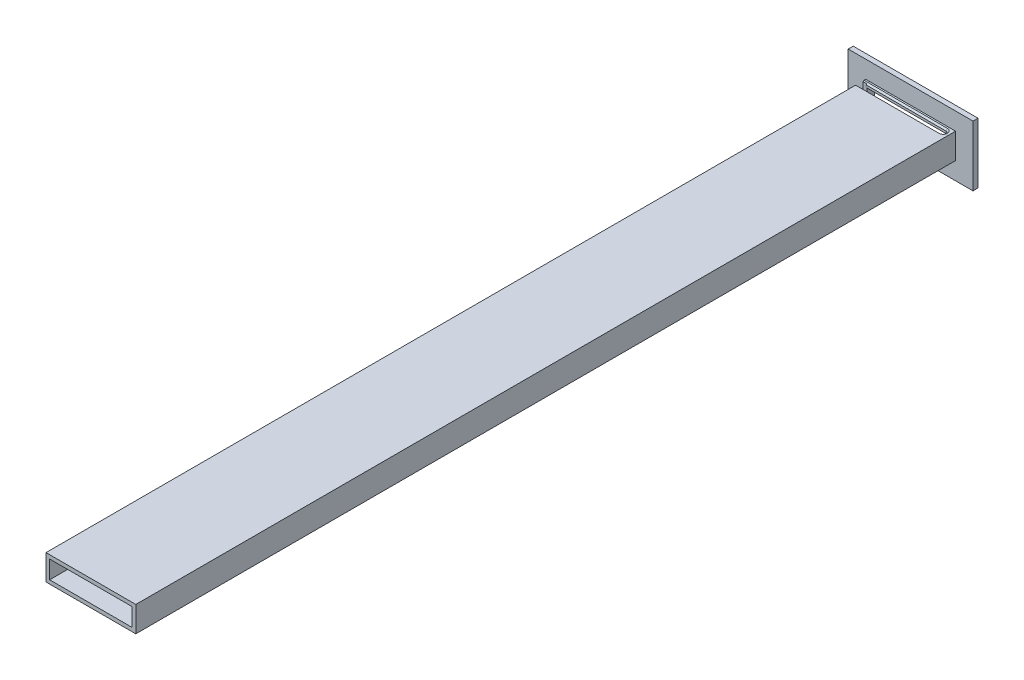
ISO-10303-21;
HEADER;
FILE_DESCRIPTION(('STEP AP214'),'2;1');
FILE_NAME('part.step','',(''),(''),'','','');
FILE_SCHEMA(('AUTOMOTIVE_DESIGN { 1 0 10303 214 1 1 1 1 }'));
ENDSEC;
DATA;
#1=APPLICATION_CONTEXT('core data for automotive mechanical design processes');
#2=APPLICATION_PROTOCOL_DEFINITION('international standard','automotive_design',2000,#1);
#3=PRODUCT_CONTEXT('',#1,'mechanical');
#4=PRODUCT('Part','Part','',(#3));
#5=PRODUCT_RELATED_PRODUCT_CATEGORY('part','',(#4));
#6=PRODUCT_DEFINITION_FORMATION('','',#4);
#7=PRODUCT_DEFINITION_CONTEXT('part definition',#1,'design');
#8=PRODUCT_DEFINITION('design','',#6,#7);
#9=PRODUCT_DEFINITION_SHAPE('','',#8);
#10=(LENGTH_UNIT() NAMED_UNIT(*) SI_UNIT(.MILLI.,.METRE.));
#11=(NAMED_UNIT(*) PLANE_ANGLE_UNIT() SI_UNIT($,.RADIAN.));
#12=(NAMED_UNIT(*) SI_UNIT($,.STERADIAN.) SOLID_ANGLE_UNIT());
#13=UNCERTAINTY_MEASURE_WITH_UNIT(LENGTH_MEASURE(1.E-05),#10,'distance_accuracy_value','');
#14=(GEOMETRIC_REPRESENTATION_CONTEXT(3) GLOBAL_UNCERTAINTY_ASSIGNED_CONTEXT((#13)) GLOBAL_UNIT_ASSIGNED_CONTEXT((#10,
#11,#12)) REPRESENTATION_CONTEXT('',''));
#15=CARTESIAN_POINT('',(0.,0.,0.));
#16=DIRECTION('',(0.,0.,1.));
#17=DIRECTION('',(1.,0.,0.));
#18=AXIS2_PLACEMENT_3D('',#15,#16,#17);
#19=CARTESIAN_POINT('',(-16.5,3.6,330.));
#20=DIRECTION('',(0.,-1.,0.));
#21=DIRECTION('',(0.,0.,-1.));
#22=AXIS2_PLACEMENT_3D('',#19,#20,#21);
#23=PLANE('',#22);
#24=DIRECTION('',(0.,0.,-1.));
#25=VECTOR('',#24,1.);
#26=CARTESIAN_POINT('',(-16.5,3.6,0.));
#27=LINE('',#26,#25);
#28=CARTESIAN_POINT('',(-16.5,3.6,3.24999999999998));
#29=VERTEX_POINT('',#28);
#30=CARTESIAN_POINT('',(-16.5,3.6,3.));
#31=VERTEX_POINT('',#30);
#32=EDGE_CURVE('E325',#29,#31,#27,.T.);
#33=ORIENTED_EDGE('',*,*,#32,.T.);
#34=DIRECTION('',(0.,0.,-1.));
#35=VECTOR('',#34,1.);
#36=CARTESIAN_POINT('',(-16.5,3.6,330.));
#37=LINE('',#36,#35);
#38=CARTESIAN_POINT('',(-16.5,3.6,0.));
#39=VERTEX_POINT('',#38);
#40=EDGE_CURVE('E404',#31,#39,#37,.T.);
#41=ORIENTED_EDGE('',*,*,#40,.T.);
#42=DIRECTION('',(-1.,0.,0.));
#43=VECTOR('',#42,1.);
#44=CARTESIAN_POINT('',(-16.5,3.6,0.));
#45=LINE('',#44,#43);
#46=CARTESIAN_POINT('',(16.5,3.6,0.));
#47=VERTEX_POINT('',#46);
#48=EDGE_CURVE('E387',#47,#39,#45,.T.);
#49=ORIENTED_EDGE('',*,*,#48,.F.);
#50=DIRECTION('',(0.,0.,-1.));
#51=VECTOR('',#50,1.);
#52=CARTESIAN_POINT('',(16.5,3.6,330.));
#53=LINE('',#52,#51);
#54=CARTESIAN_POINT('',(16.5,3.6,4.35000000000002));
#55=VERTEX_POINT('',#54);
#56=EDGE_CURVE('E409',#55,#47,#53,.T.);
#57=ORIENTED_EDGE('',*,*,#56,.F.);
#58=CARTESIAN_POINT('',(15.4,3.6,4.35000000000002));
#59=DIRECTION('',(0.,-1.,0.));
#60=DIRECTION('',(0.,0.,-1.));
#61=AXIS2_PLACEMENT_3D('',#58,#59,#60);
#62=CIRCLE('',#61,1.10000000000002);
#63=CARTESIAN_POINT('',(15.4,3.6,3.24999999999998));
#64=VERTEX_POINT('',#63);
#65=EDGE_CURVE('E315',#55,#64,#62,.F.);
#66=ORIENTED_EDGE('',*,*,#65,.T.);
#67=DIRECTION('',(1.,0.,0.));
#68=VECTOR('',#67,1.);
#69=CARTESIAN_POINT('',(0.,3.6,3.24999999999998));
#70=LINE('',#69,#68);
#71=EDGE_CURVE('E318',#29,#64,#70,.T.);
#72=ORIENTED_EDGE('',*,*,#71,.F.);
#73=EDGE_LOOP('',(#33,#41,#49,#57,#66,#72));
#74=FACE_BOUND('',#73,.T.);
#75=ADVANCED_FACE('F41',(#74),#23,.T.);
#76=CARTESIAN_POINT('',(-17.9659090909091,5.10000000000001,330.));
#77=DIRECTION('',(1.,0.,0.));
#78=DIRECTION('',(0.,0.,-1.));
#79=AXIS2_PLACEMENT_3D('',#76,#77,#78);
#80=PLANE('',#79);
#81=DIRECTION('',(0.,0.,-1.));
#82=VECTOR('',#81,1.);
#83=CARTESIAN_POINT('',(-17.9659090909091,5.10000000000001,330.));
#84=LINE('',#83,#82);
#85=CARTESIAN_POINT('',(-17.9659090909091,5.10000000000001,2.65000000000004));
#86=VERTEX_POINT('',#85);
#87=CARTESIAN_POINT('',(-17.9659090909091,5.10000000000001,2.));
#88=VERTEX_POINT('',#87);
#89=EDGE_CURVE('E237',#86,#88,#84,.T.);
#90=ORIENTED_EDGE('',*,*,#89,.T.);
#91=DIRECTION('',(0.,1.,0.));
#92=VECTOR('',#91,1.);
#93=CARTESIAN_POINT('',(-17.9659090909091,5.10000000000001,2.));
#94=LINE('',#93,#92);
#95=CARTESIAN_POINT('',(-17.9659090909091,-5.1,2.));
#96=VERTEX_POINT('',#95);
#97=EDGE_CURVE('E205',#96,#88,#94,.T.);
#98=ORIENTED_EDGE('',*,*,#97,.F.);
#99=DIRECTION('',(0.,0.,-1.));
#100=VECTOR('',#99,1.);
#101=CARTESIAN_POINT('',(-17.9659090909091,-5.1,330.));
#102=LINE('',#101,#100);
#103=CARTESIAN_POINT('',(-17.9659090909091,-5.1,330.));
#104=VERTEX_POINT('',#103);
#105=EDGE_CURVE('E426',#104,#96,#102,.T.);
#106=ORIENTED_EDGE('',*,*,#105,.F.);
#107=DIRECTION('',(0.,-1.,0.));
#108=VECTOR('',#107,1.);
#109=CARTESIAN_POINT('',(-17.9659090909091,5.10000000000001,330.));
#110=LINE('',#109,#108);
#111=CARTESIAN_POINT('',(-17.9659090909091,5.10000000000001,330.));
#112=VERTEX_POINT('',#111);
#113=EDGE_CURVE('E419',#112,#104,#110,.T.);
#114=ORIENTED_EDGE('',*,*,#113,.F.);
#115=CARTESIAN_POINT('',(-17.9659090909091,5.10000000000001,6.05000000000006));
#116=VERTEX_POINT('',#115);
#117=EDGE_CURVE('E229',#112,#116,#84,.T.);
#118=ORIENTED_EDGE('',*,*,#117,.T.);
#119=DIRECTION('',(0.,-0.707106781186523,-0.707106781186572));
#120=VECTOR('',#119,1.);
#121=CARTESIAN_POINT('',(-17.9659090909091,5.10000000000001,6.05000000000006));
#122=LINE('',#121,#120);
#123=CARTESIAN_POINT('',(-17.9659090909091,4.74999999999998,5.7));
#124=VERTEX_POINT('',#123);
#125=EDGE_CURVE('E266',#116,#124,#122,.T.);
#126=ORIENTED_EDGE('',*,*,#125,.T.);
#127=DIRECTION('',(0.,-1.,0.));
#128=VECTOR('',#127,1.);
#129=CARTESIAN_POINT('',(-17.9659090909091,0.,5.7));
#130=LINE('',#129,#128);
#131=CARTESIAN_POINT('',(-17.9659090909091,0.399999999999998,5.69999999999998));
#132=VERTEX_POINT('',#131);
#133=EDGE_CURVE('E350',#124,#132,#130,.T.);
#134=ORIENTED_EDGE('',*,*,#133,.T.);
#135=DIRECTION('',(0.,0.,1.));
#136=VECTOR('',#135,1.);
#137=CARTESIAN_POINT('',(-17.9659090909091,0.399999999999994,0.));
#138=LINE('',#137,#136);
#139=CARTESIAN_POINT('',(-17.9659090909091,0.399999999999996,3.));
#140=VERTEX_POINT('',#139);
#141=EDGE_CURVE('E356',#140,#132,#138,.T.);
#142=ORIENTED_EDGE('',*,*,#141,.F.);
#143=DIRECTION('',(0.,-1.,0.));
#144=VECTOR('',#143,1.);
#145=CARTESIAN_POINT('',(-17.9659090909091,0.,3.));
#146=LINE('',#145,#144);
#147=CARTESIAN_POINT('',(-17.9659090909091,4.75000000000003,3.));
#148=VERTEX_POINT('',#147);
#149=EDGE_CURVE('E353',#148,#140,#146,.T.);
#150=ORIENTED_EDGE('',*,*,#149,.F.);
#151=DIRECTION('',(0.,0.707106781186563,-0.707106781186532));
#152=VECTOR('',#151,1.);
#153=CARTESIAN_POINT('',(-17.9659090909091,5.10000000000001,2.65000000000004));
#154=LINE('',#153,#152);
#155=EDGE_CURVE('E269',#148,#86,#154,.T.);
#156=ORIENTED_EDGE('',*,*,#155,.T.);
#157=EDGE_LOOP('',(#90,#98,#106,#114,#118,#126,#134,#142,#150,#156));
#158=FACE_BOUND('',#157,.T.);
#159=ADVANCED_FACE('F434',(#158),#80,.F.);
#160=CARTESIAN_POINT('',(0.,0.,330.));
#161=DIRECTION('',(0.,0.,1.));
#162=DIRECTION('',(1.,0.,0.));
#163=AXIS2_PLACEMENT_3D('',#160,#161,#162);
#164=PLANE('',#163);
#165=DIRECTION('',(0.,1.,0.));
#166=VECTOR('',#165,1.);
#167=CARTESIAN_POINT('',(17.9659090909091,5.10000000000001,330.));
#168=LINE('',#167,#166);
#169=CARTESIAN_POINT('',(17.9659090909091,-5.1,330.));
#170=VERTEX_POINT('',#169);
#171=CARTESIAN_POINT('',(17.9659090909091,5.10000000000001,330.));
#172=VERTEX_POINT('',#171);
#173=EDGE_CURVE('E414',#170,#172,#168,.T.);
#174=ORIENTED_EDGE('',*,*,#173,.T.);
#175=DIRECTION('',(-1.,0.,0.));
#176=VECTOR('',#175,1.);
#177=CARTESIAN_POINT('',(-17.9659090909091,5.10000000000001,330.));
#178=LINE('',#177,#176);
#179=EDGE_CURVE('E225',#172,#112,#178,.T.);
#180=ORIENTED_EDGE('',*,*,#179,.T.);
#181=ORIENTED_EDGE('',*,*,#113,.T.);
#182=DIRECTION('',(1.,0.,0.));
#183=VECTOR('',#182,1.);
#184=CARTESIAN_POINT('',(-17.9659090909091,-5.1,330.));
#185=LINE('',#184,#183);
#186=EDGE_CURVE('E422',#104,#170,#185,.T.);
#187=ORIENTED_EDGE('',*,*,#186,.T.);
#188=EDGE_LOOP('',(#174,#180,#181,#187));
#189=FACE_BOUND('',#188,.T.);
#190=DIRECTION('',(-1.,0.,0.));
#191=VECTOR('',#190,1.);
#192=CARTESIAN_POINT('',(-16.5,3.6,330.));
#193=LINE('',#192,#191);
#194=CARTESIAN_POINT('',(16.5,3.6,330.));
#195=VERTEX_POINT('',#194);
#196=CARTESIAN_POINT('',(-16.5,3.6,330.));
#197=VERTEX_POINT('',#196);
#198=EDGE_CURVE('E372',#195,#197,#193,.T.);
#199=ORIENTED_EDGE('',*,*,#198,.F.);
#200=DIRECTION('',(0.,1.,0.));
#201=VECTOR('',#200,1.);
#202=CARTESIAN_POINT('',(16.5,3.6,330.));
#203=LINE('',#202,#201);
#204=CARTESIAN_POINT('',(16.5,-3.6,330.));
#205=VERTEX_POINT('',#204);
#206=EDGE_CURVE('E369',#205,#195,#203,.T.);
#207=ORIENTED_EDGE('',*,*,#206,.F.);
#208=DIRECTION('',(1.,0.,0.));
#209=VECTOR('',#208,1.);
#210=CARTESIAN_POINT('',(-16.5,-3.6,330.));
#211=LINE('',#210,#209);
#212=CARTESIAN_POINT('',(-16.5,-3.6,330.));
#213=VERTEX_POINT('',#212);
#214=EDGE_CURVE('E380',#213,#205,#211,.T.);
#215=ORIENTED_EDGE('',*,*,#214,.F.);
#216=DIRECTION('',(0.,-1.,0.));
#217=VECTOR('',#216,1.);
#218=CARTESIAN_POINT('',(-16.5,3.6,330.));
#219=LINE('',#218,#217);
#220=EDGE_CURVE('E376',#197,#213,#219,.T.);
#221=ORIENTED_EDGE('',*,*,#220,.F.);
#222=EDGE_LOOP('',(#199,#207,#215,#221));
#223=FACE_BOUND('',#222,.T.);
#224=ADVANCED_FACE('F465',(#189,#223),#164,.T.);
#225=CARTESIAN_POINT('',(0.,0.,0.));
#226=DIRECTION('',(0.,0.,1.));
#227=DIRECTION('',(1.,0.,0.));
#228=AXIS2_PLACEMENT_3D('',#225,#226,#227);
#229=PLANE('',#228);
#230=DIRECTION('',(0.,1.,0.));
#231=VECTOR('',#230,1.);
#232=CARTESIAN_POINT('',(16.5,3.6,0.));
#233=LINE('',#232,#231);
#234=CARTESIAN_POINT('',(16.5,-3.6,0.));
#235=VERTEX_POINT('',#234);
#236=EDGE_CURVE('E365',#235,#47,#233,.T.);
#237=ORIENTED_EDGE('',*,*,#236,.T.);
#238=ORIENTED_EDGE('',*,*,#48,.T.);
#239=DIRECTION('',(0.,-1.,0.));
#240=VECTOR('',#239,1.);
#241=CARTESIAN_POINT('',(-16.5,3.6,0.));
#242=LINE('',#241,#240);
#243=CARTESIAN_POINT('',(-16.5,-3.6,0.));
#244=VERTEX_POINT('',#243);
#245=EDGE_CURVE('E391',#39,#244,#242,.T.);
#246=ORIENTED_EDGE('',*,*,#245,.T.);
#247=DIRECTION('',(1.,0.,0.));
#248=VECTOR('',#247,1.);
#249=CARTESIAN_POINT('',(-16.5,-3.6,0.));
#250=LINE('',#249,#248);
#251=EDGE_CURVE('E373',#244,#235,#250,.T.);
#252=ORIENTED_EDGE('',*,*,#251,.T.);
#253=EDGE_LOOP('',(#237,#238,#246,#252));
#254=FACE_BOUND('',#253,.T.);
#255=DIRECTION('',(0.,1.,0.));
#256=VECTOR('',#255,1.);
#257=CARTESIAN_POINT('',(-24.9659090909091,-12.1,0.));
#258=LINE('',#257,#256);
#259=CARTESIAN_POINT('',(-24.9659090909091,-12.1,0.));
#260=VERTEX_POINT('',#259);
#261=CARTESIAN_POINT('',(-24.9659090909091,12.1,0.));
#262=VERTEX_POINT('',#261);
#263=EDGE_CURVE('E508',#260,#262,#258,.T.);
#264=ORIENTED_EDGE('',*,*,#263,.T.);
#265=DIRECTION('',(1.,0.,0.));
#266=VECTOR('',#265,1.);
#267=CARTESIAN_POINT('',(24.9659090909091,12.1,0.));
#268=LINE('',#267,#266);
#269=CARTESIAN_POINT('',(24.9659090909091,12.1,0.));
#270=VERTEX_POINT('',#269);
#271=EDGE_CURVE('E528',#262,#270,#268,.T.);
#272=ORIENTED_EDGE('',*,*,#271,.T.);
#273=DIRECTION('',(0.,-1.,0.));
#274=VECTOR('',#273,1.);
#275=CARTESIAN_POINT('',(24.9659090909091,-12.1,0.));
#276=LINE('',#275,#274);
#277=CARTESIAN_POINT('',(24.9659090909091,-12.1,0.));
#278=VERTEX_POINT('',#277);
#279=EDGE_CURVE('E531',#270,#278,#276,.T.);
#280=ORIENTED_EDGE('',*,*,#279,.T.);
#281=DIRECTION('',(-1.,0.,0.));
#282=VECTOR('',#281,1.);
#283=CARTESIAN_POINT('',(24.9659090909091,-12.1,0.));
#284=LINE('',#283,#282);
#285=EDGE_CURVE('E301',#278,#260,#284,.T.);
#286=ORIENTED_EDGE('',*,*,#285,.T.);
#287=EDGE_LOOP('',(#264,#272,#280,#286));
#288=FACE_BOUND('',#287,.T.);
#289=ADVANCED_FACE('F474',(#254,#288),#229,.F.);
#290=CARTESIAN_POINT('',(17.9659090909091,5.10000000000001,330.));
#291=DIRECTION('',(-1.,0.,0.));
#292=DIRECTION('',(0.,-1.,0.));
#293=AXIS2_PLACEMENT_3D('',#290,#291,#292);
#294=PLANE('',#293);
#295=DIRECTION('',(0.,0.,-1.));
#296=VECTOR('',#295,1.);
#297=CARTESIAN_POINT('',(17.9659090909091,-5.1,330.));
#298=LINE('',#297,#296);
#299=CARTESIAN_POINT('',(17.9659090909091,-5.1,2.));
#300=VERTEX_POINT('',#299);
#301=EDGE_CURVE('E219',#170,#300,#298,.T.);
#302=ORIENTED_EDGE('',*,*,#301,.T.);
#303=DIRECTION('',(0.,-1.,0.));
#304=VECTOR('',#303,1.);
#305=CARTESIAN_POINT('',(17.9659090909091,-5.1,2.));
#306=LINE('',#305,#304);
#307=CARTESIAN_POINT('',(17.9659090909091,5.10000000000001,2.));
#308=VERTEX_POINT('',#307);
#309=EDGE_CURVE('E60',#308,#300,#306,.T.);
#310=ORIENTED_EDGE('',*,*,#309,.F.);
#311=DIRECTION('',(0.,0.,-1.));
#312=VECTOR('',#311,1.);
#313=CARTESIAN_POINT('',(17.9659090909091,5.10000000000001,330.));
#314=LINE('',#313,#312);
#315=EDGE_CURVE('E217',#172,#308,#314,.T.);
#316=ORIENTED_EDGE('',*,*,#315,.F.);
#317=ORIENTED_EDGE('',*,*,#173,.F.);
#318=EDGE_LOOP('',(#302,#310,#316,#317));
#319=FACE_BOUND('',#318,.T.);
#320=ADVANCED_FACE('F215',(#319),#294,.F.);
#321=CARTESIAN_POINT('',(-17.9659090909091,5.10000000000001,330.));
#322=DIRECTION('',(0.,-1.,0.));
#323=DIRECTION('',(0.,0.,-1.));
#324=AXIS2_PLACEMENT_3D('',#321,#322,#323);
#325=PLANE('',#324);
#326=ORIENTED_EDGE('',*,*,#315,.T.);
#327=DIRECTION('',(1.,0.,0.));
#328=VECTOR('',#327,1.);
#329=CARTESIAN_POINT('',(17.9659090909091,5.10000000000001,2.));
#330=LINE('',#329,#328);
#331=EDGE_CURVE('E201',#88,#308,#330,.T.);
#332=ORIENTED_EDGE('',*,*,#331,.F.);
#333=ORIENTED_EDGE('',*,*,#89,.F.);
#334=DIRECTION('',(1.,0.,0.));
#335=VECTOR('',#334,1.);
#336=CARTESIAN_POINT('',(15.4,5.10000000000001,2.65000000000005));
#337=LINE('',#336,#335);
#338=CARTESIAN_POINT('',(15.4,5.10000000000001,2.64999999999998));
#339=VERTEX_POINT('',#338);
#340=EDGE_CURVE('E253',#86,#339,#337,.T.);
#341=ORIENTED_EDGE('',*,*,#340,.T.);
#342=CARTESIAN_POINT('',(15.4,5.10000000000001,4.35000000000002));
#343=DIRECTION('',(0.,-1.,0.));
#344=DIRECTION('',(0.,0.,-1.));
#345=AXIS2_PLACEMENT_3D('',#342,#343,#344);
#346=CIRCLE('',#345,1.70000000000004);
#347=CARTESIAN_POINT('',(15.4,5.10000000000001,6.05000000000005));
#348=VERTEX_POINT('',#347);
#349=EDGE_CURVE('E250',#339,#348,#346,.T.);
#350=ORIENTED_EDGE('',*,*,#349,.T.);
#351=DIRECTION('',(-1.,0.,0.));
#352=VECTOR('',#351,1.);
#353=CARTESIAN_POINT('',(-16.5,5.10000000000001,6.05000000000006));
#354=LINE('',#353,#352);
#355=EDGE_CURVE('E247',#348,#116,#354,.T.);
#356=ORIENTED_EDGE('',*,*,#355,.T.);
#357=ORIENTED_EDGE('',*,*,#117,.F.);
#358=ORIENTED_EDGE('',*,*,#179,.F.);
#359=EDGE_LOOP('',(#326,#332,#333,#341,#350,#356,#357,#358));
#360=FACE_BOUND('',#359,.T.);
#361=ADVANCED_FACE('F223',(#360),#325,.F.);
#362=CARTESIAN_POINT('',(-17.9659090909091,-5.1,330.));
#363=DIRECTION('',(0.,1.,0.));
#364=DIRECTION('',(-1.,0.,0.));
#365=AXIS2_PLACEMENT_3D('',#362,#363,#364);
#366=PLANE('',#365);
#367=ORIENTED_EDGE('',*,*,#105,.T.);
#368=DIRECTION('',(-1.,0.,0.));
#369=VECTOR('',#368,1.);
#370=CARTESIAN_POINT('',(-17.9659090909091,-5.1,2.));
#371=LINE('',#370,#369);
#372=EDGE_CURVE('E221',#300,#96,#371,.T.);
#373=ORIENTED_EDGE('',*,*,#372,.F.);
#374=ORIENTED_EDGE('',*,*,#301,.F.);
#375=ORIENTED_EDGE('',*,*,#186,.F.);
#376=EDGE_LOOP('',(#367,#373,#374,#375));
#377=FACE_BOUND('',#376,.T.);
#378=ADVANCED_FACE('F504',(#377),#366,.F.);
#379=CARTESIAN_POINT('',(16.5,3.6,330.));
#380=DIRECTION('',(-1.,0.,0.));
#381=DIRECTION('',(0.,-1.,0.));
#382=AXIS2_PLACEMENT_3D('',#379,#380,#381);
#383=PLANE('',#382);
#384=EDGE_CURVE('E410',#195,#55,#53,.T.);
#385=ORIENTED_EDGE('',*,*,#384,.T.);
#386=ORIENTED_EDGE('',*,*,#56,.T.);
#387=ORIENTED_EDGE('',*,*,#236,.F.);
#388=DIRECTION('',(0.,0.,-1.));
#389=VECTOR('',#388,1.);
#390=CARTESIAN_POINT('',(16.5,-3.6,330.));
#391=LINE('',#390,#389);
#392=EDGE_CURVE('E383',#205,#235,#391,.T.);
#393=ORIENTED_EDGE('',*,*,#392,.F.);
#394=ORIENTED_EDGE('',*,*,#206,.T.);
#395=EDGE_LOOP('',(#385,#386,#387,#393,#394));
#396=FACE_BOUND('',#395,.T.);
#397=ADVANCED_FACE('F568',(#396),#383,.T.);
#398=CARTESIAN_POINT('',(15.4,3.6,5.45000000000004));
#399=VERTEX_POINT('',#398);
#400=EDGE_CURVE('E310',#399,#55,#62,.F.);
#401=ORIENTED_EDGE('',*,*,#400,.T.);
#402=ORIENTED_EDGE('',*,*,#384,.F.);
#403=ORIENTED_EDGE('',*,*,#198,.T.);
#404=CARTESIAN_POINT('',(-16.5,3.6,5.69999999999998));
#405=VERTEX_POINT('',#404);
#406=EDGE_CURVE('E405',#197,#405,#37,.T.);
#407=ORIENTED_EDGE('',*,*,#406,.T.);
#408=DIRECTION('',(0.,0.,-1.));
#409=VECTOR('',#408,1.);
#410=CARTESIAN_POINT('',(-16.5,3.6,0.));
#411=LINE('',#410,#409);
#412=CARTESIAN_POINT('',(-16.5,3.6,5.45000000000002));
#413=VERTEX_POINT('',#412);
#414=EDGE_CURVE('E319',#405,#413,#411,.T.);
#415=ORIENTED_EDGE('',*,*,#414,.T.);
#416=DIRECTION('',(-1.,0.,0.));
#417=VECTOR('',#416,1.);
#418=CARTESIAN_POINT('',(0.,3.6,5.45000000000002));
#419=LINE('',#418,#417);
#420=EDGE_CURVE('E290',#399,#413,#419,.T.);
#421=ORIENTED_EDGE('',*,*,#420,.F.);
#422=EDGE_LOOP('',(#401,#402,#403,#407,#415,#421));
#423=FACE_BOUND('',#422,.T.);
#424=ADVANCED_FACE('F459',(#423),#23,.T.);
#425=CARTESIAN_POINT('',(-16.5,3.6,330.));
#426=DIRECTION('',(1.,0.,0.));
#427=DIRECTION('',(0.,1.,0.));
#428=AXIS2_PLACEMENT_3D('',#425,#426,#427);
#429=PLANE('',#428);
#430=DIRECTION('',(0.,1.,0.));
#431=VECTOR('',#430,1.);
#432=CARTESIAN_POINT('',(-16.5,3.6,3.));
#433=LINE('',#432,#431);
#434=CARTESIAN_POINT('',(-16.5,0.399999999999996,3.));
#435=VERTEX_POINT('',#434);
#436=EDGE_CURVE('E243',#435,#31,#433,.T.);
#437=ORIENTED_EDGE('',*,*,#436,.F.);
#438=DIRECTION('',(0.,0.,-1.));
#439=VECTOR('',#438,1.);
#440=CARTESIAN_POINT('',(-16.5,0.400000000000259,330.));
#441=LINE('',#440,#439);
#442=CARTESIAN_POINT('',(-16.5,0.399999999999998,5.7));
#443=VERTEX_POINT('',#442);
#444=EDGE_CURVE('E234',#443,#435,#441,.T.);
#445=ORIENTED_EDGE('',*,*,#444,.F.);
#446=DIRECTION('',(0.,1.,0.));
#447=VECTOR('',#446,1.);
#448=CARTESIAN_POINT('',(-16.5,3.6,5.69999999999998));
#449=LINE('',#448,#447);
#450=EDGE_CURVE('E228',#443,#405,#449,.T.);
#451=ORIENTED_EDGE('',*,*,#450,.T.);
#452=ORIENTED_EDGE('',*,*,#406,.F.);
#453=ORIENTED_EDGE('',*,*,#220,.T.);
#454=DIRECTION('',(0.,0.,-1.));
#455=VECTOR('',#454,1.);
#456=CARTESIAN_POINT('',(-16.5,-3.6,330.));
#457=LINE('',#456,#455);
#458=EDGE_CURVE('E401',#213,#244,#457,.T.);
#459=ORIENTED_EDGE('',*,*,#458,.T.);
#460=ORIENTED_EDGE('',*,*,#245,.F.);
#461=ORIENTED_EDGE('',*,*,#40,.F.);
#462=EDGE_LOOP('',(#437,#445,#451,#452,#453,#459,#460,#461));
#463=FACE_BOUND('',#462,.T.);
#464=ADVANCED_FACE('F456',(#463),#429,.T.);
#465=CARTESIAN_POINT('',(-16.5,-3.6,330.));
#466=DIRECTION('',(0.,1.,0.));
#467=DIRECTION('',(0.,0.,1.));
#468=AXIS2_PLACEMENT_3D('',#465,#466,#467);
#469=PLANE('',#468);
#470=ORIENTED_EDGE('',*,*,#251,.F.);
#471=ORIENTED_EDGE('',*,*,#458,.F.);
#472=ORIENTED_EDGE('',*,*,#214,.T.);
#473=ORIENTED_EDGE('',*,*,#392,.T.);
#474=EDGE_LOOP('',(#470,#471,#472,#473));
#475=FACE_BOUND('',#474,.T.);
#476=ADVANCED_FACE('F471',(#475),#469,.T.);
#477=CARTESIAN_POINT('',(20.6868842830917,0.,3.));
#478=DIRECTION('',(0.,0.,-1.));
#479=DIRECTION('',(-1.,0.,0.));
#480=AXIS2_PLACEMENT_3D('',#477,#478,#479);
#481=PLANE('',#480);
#482=DIRECTION('',(0.,1.,0.));
#483=VECTOR('',#482,1.);
#484=CARTESIAN_POINT('',(-16.5,-30.9715040092677,3.));
#485=LINE('',#484,#483);
#486=CARTESIAN_POINT('',(-16.5,4.75000000000003,3.));
#487=VERTEX_POINT('',#486);
#488=EDGE_CURVE('E329',#31,#487,#485,.T.);
#489=ORIENTED_EDGE('',*,*,#488,.T.);
#490=DIRECTION('',(-1.,0.,0.));
#491=VECTOR('',#490,1.);
#492=CARTESIAN_POINT('',(-17.9659090909091,4.75000000000003,3.));
#493=LINE('',#492,#491);
#494=EDGE_CURVE('E263',#487,#148,#493,.T.);
#495=ORIENTED_EDGE('',*,*,#494,.T.);
#496=ORIENTED_EDGE('',*,*,#149,.T.);
#497=DIRECTION('',(-1.,0.,0.));
#498=VECTOR('',#497,1.);
#499=CARTESIAN_POINT('',(20.6868842830917,0.399999999999996,3.));
#500=LINE('',#499,#498);
#501=EDGE_CURVE('E360',#435,#140,#500,.T.);
#502=ORIENTED_EDGE('',*,*,#501,.F.);
#503=ORIENTED_EDGE('',*,*,#436,.T.);
#504=EDGE_LOOP('',(#489,#495,#496,#502,#503));
#505=FACE_BOUND('',#504,.T.);
#506=ADVANCED_FACE('F441',(#505),#481,.F.);
#507=CARTESIAN_POINT('',(20.6868842830917,0.399999999999994,0.));
#508=DIRECTION('',(0.,-1.,0.));
#509=DIRECTION('',(0.,0.,-1.));
#510=AXIS2_PLACEMENT_3D('',#507,#508,#509);
#511=PLANE('',#510);
#512=ORIENTED_EDGE('',*,*,#444,.T.);
#513=ORIENTED_EDGE('',*,*,#501,.T.);
#514=ORIENTED_EDGE('',*,*,#141,.T.);
#515=DIRECTION('',(-1.,0.,0.));
#516=VECTOR('',#515,1.);
#517=CARTESIAN_POINT('',(20.6868842830917,0.399999999999998,5.7));
#518=LINE('',#517,#516);
#519=EDGE_CURVE('E361',#443,#132,#518,.T.);
#520=ORIENTED_EDGE('',*,*,#519,.F.);
#521=EDGE_LOOP('',(#512,#513,#514,#520));
#522=FACE_BOUND('',#521,.T.);
#523=ADVANCED_FACE('F447',(#522),#511,.F.);
#524=CARTESIAN_POINT('',(20.6868842830917,0.,5.7));
#525=DIRECTION('',(0.,0.,-1.));
#526=DIRECTION('',(-1.,0.,0.));
#527=AXIS2_PLACEMENT_3D('',#524,#525,#526);
#528=PLANE('',#527);
#529=ORIENTED_EDGE('',*,*,#133,.F.);
#530=DIRECTION('',(1.,0.,0.));
#531=VECTOR('',#530,1.);
#532=CARTESIAN_POINT('',(20.6868842830917,4.74999999999998,5.7));
#533=LINE('',#532,#531);
#534=CARTESIAN_POINT('',(-16.5,4.74999999999998,5.7));
#535=VERTEX_POINT('',#534);
#536=EDGE_CURVE('E275',#124,#535,#533,.T.);
#537=ORIENTED_EDGE('',*,*,#536,.T.);
#538=DIRECTION('',(0.,1.,0.));
#539=VECTOR('',#538,1.);
#540=CARTESIAN_POINT('',(-16.5,-30.9715040092677,5.7));
#541=LINE('',#540,#539);
#542=EDGE_CURVE('E324',#405,#535,#541,.T.);
#543=ORIENTED_EDGE('',*,*,#542,.F.);
#544=ORIENTED_EDGE('',*,*,#450,.F.);
#545=ORIENTED_EDGE('',*,*,#519,.T.);
#546=EDGE_LOOP('',(#529,#537,#543,#544,#545));
#547=FACE_BOUND('',#546,.T.);
#548=ADVANCED_FACE('F450',(#547),#528,.T.);
#549=CARTESIAN_POINT('',(15.4,-30.9715040092677,4.35000000000002));
#550=DIRECTION('',(0.,1.,0.));
#551=DIRECTION('',(0.,0.,1.));
#552=AXIS2_PLACEMENT_3D('',#549,#550,#551);
#553=CYLINDRICAL_SURFACE('',#552,1.10000000000002);
#554=DIRECTION('',(0.,1.,0.));
#555=VECTOR('',#554,1.);
#556=CARTESIAN_POINT('',(15.4,-30.9715040092677,5.45000000000002));
#557=LINE('',#556,#555);
#558=CARTESIAN_POINT('',(15.4,4.50000000000002,5.45000000000002));
#559=VERTEX_POINT('',#558);
#560=EDGE_CURVE('E335',#399,#559,#557,.T.);
#561=ORIENTED_EDGE('',*,*,#560,.T.);
#562=CARTESIAN_POINT('',(15.4,4.50000000000002,4.35000000000002));
#563=DIRECTION('',(0.,-1.,0.));
#564=DIRECTION('',(0.,0.,-1.));
#565=AXIS2_PLACEMENT_3D('',#562,#563,#564);
#566=CIRCLE('',#565,1.10000000000002);
#567=CARTESIAN_POINT('',(15.4,4.50000000000002,3.24999999999998));
#568=VERTEX_POINT('',#567);
#569=EDGE_CURVE('E272',#559,#568,#566,.F.);
#570=ORIENTED_EDGE('',*,*,#569,.T.);
#571=DIRECTION('',(0.,1.,0.));
#572=VECTOR('',#571,1.);
#573=CARTESIAN_POINT('',(15.4,-30.9715040092677,3.24999999999998));
#574=LINE('',#573,#572);
#575=EDGE_CURVE('E314',#64,#568,#574,.T.);
#576=ORIENTED_EDGE('',*,*,#575,.F.);
#577=ORIENTED_EDGE('',*,*,#65,.F.);
#578=ORIENTED_EDGE('',*,*,#400,.F.);
#579=EDGE_LOOP('',(#561,#570,#576,#577,#578));
#580=FACE_BOUND('',#579,.T.);
#581=ADVANCED_FACE('F486',(#580),#553,.F.);
#582=CARTESIAN_POINT('',(0.,-30.9715040092677,3.24999999999998));
#583=DIRECTION('',(0.,0.,1.));
#584=DIRECTION('',(1.,0.,0.));
#585=AXIS2_PLACEMENT_3D('',#582,#583,#584);
#586=PLANE('',#585);
#587=ORIENTED_EDGE('',*,*,#575,.T.);
#588=DIRECTION('',(-1.,0.,0.));
#589=VECTOR('',#588,1.);
#590=CARTESIAN_POINT('',(-16.5,4.50000000000005,3.24999999999998));
#591=LINE('',#590,#589);
#592=CARTESIAN_POINT('',(-16.5,4.50000000000005,3.24999999999998));
#593=VERTEX_POINT('',#592);
#594=EDGE_CURVE('E257',#568,#593,#591,.T.);
#595=ORIENTED_EDGE('',*,*,#594,.T.);
#596=DIRECTION('',(0.,1.,0.));
#597=VECTOR('',#596,1.);
#598=CARTESIAN_POINT('',(-16.5,-30.9715040092677,3.24999999999998));
#599=LINE('',#598,#597);
#600=EDGE_CURVE('E330',#29,#593,#599,.T.);
#601=ORIENTED_EDGE('',*,*,#600,.F.);
#602=ORIENTED_EDGE('',*,*,#71,.T.);
#603=EDGE_LOOP('',(#587,#595,#601,#602));
#604=FACE_BOUND('',#603,.T.);
#605=ADVANCED_FACE('F499',(#604),#586,.T.);
#606=CARTESIAN_POINT('',(-16.5,-30.9715040092677,0.));
#607=DIRECTION('',(1.,0.,0.));
#608=DIRECTION('',(0.,0.,-1.));
#609=AXIS2_PLACEMENT_3D('',#606,#607,#608);
#610=PLANE('',#609);
#611=ORIENTED_EDGE('',*,*,#600,.T.);
#612=DIRECTION('',(0.,0.707106781186563,-0.707106781186532));
#613=VECTOR('',#612,1.);
#614=CARTESIAN_POINT('',(-16.5,5.10000000000001,2.65000000000004));
#615=LINE('',#614,#613);
#616=EDGE_CURVE('E260',#593,#487,#615,.T.);
#617=ORIENTED_EDGE('',*,*,#616,.T.);
#618=ORIENTED_EDGE('',*,*,#488,.F.);
#619=ORIENTED_EDGE('',*,*,#32,.F.);
#620=EDGE_LOOP('',(#611,#617,#618,#619));
#621=FACE_BOUND('',#620,.T.);
#622=ADVANCED_FACE('F606',(#621),#610,.F.);
#623=CARTESIAN_POINT('',(-16.5,-30.9715040092677,0.));
#624=DIRECTION('',(1.,0.,0.));
#625=DIRECTION('',(0.,0.,-1.));
#626=AXIS2_PLACEMENT_3D('',#623,#624,#625);
#627=PLANE('',#626);
#628=ORIENTED_EDGE('',*,*,#542,.T.);
#629=DIRECTION('',(0.,-0.707106781186523,-0.707106781186572));
#630=VECTOR('',#629,1.);
#631=CARTESIAN_POINT('',(-16.5,5.10000000000001,6.05000000000006));
#632=LINE('',#631,#630);
#633=CARTESIAN_POINT('',(-16.5,4.50000000000002,5.45000000000002));
#634=VERTEX_POINT('',#633);
#635=EDGE_CURVE('E52',#535,#634,#632,.T.);
#636=ORIENTED_EDGE('',*,*,#635,.T.);
#637=DIRECTION('',(0.,1.,0.));
#638=VECTOR('',#637,1.);
#639=CARTESIAN_POINT('',(-16.5,-30.9715040092677,5.45000000000002));
#640=LINE('',#639,#638);
#641=EDGE_CURVE('E323',#413,#634,#640,.T.);
#642=ORIENTED_EDGE('',*,*,#641,.F.);
#643=ORIENTED_EDGE('',*,*,#414,.F.);
#644=EDGE_LOOP('',(#628,#636,#642,#643));
#645=FACE_BOUND('',#644,.T.);
#646=ADVANCED_FACE('F491',(#645),#627,.F.);
#647=CARTESIAN_POINT('',(0.,-30.9715040092677,5.45000000000002));
#648=DIRECTION('',(0.,0.,-1.));
#649=DIRECTION('',(-1.,0.,0.));
#650=AXIS2_PLACEMENT_3D('',#647,#648,#649);
#651=PLANE('',#650);
#652=ORIENTED_EDGE('',*,*,#641,.T.);
#653=DIRECTION('',(1.,0.,0.));
#654=VECTOR('',#653,1.);
#655=CARTESIAN_POINT('',(15.4,4.50000000000002,5.45000000000002));
#656=LINE('',#655,#654);
#657=EDGE_CURVE('E11',#634,#559,#656,.T.);
#658=ORIENTED_EDGE('',*,*,#657,.T.);
#659=ORIENTED_EDGE('',*,*,#560,.F.);
#660=ORIENTED_EDGE('',*,*,#420,.T.);
#661=EDGE_LOOP('',(#652,#658,#659,#660));
#662=FACE_BOUND('',#661,.T.);
#663=ADVANCED_FACE('F489',(#662),#651,.T.);
#664=CARTESIAN_POINT('',(-17.9659090909091,5.10000000000001,6.05000000000006));
#665=DIRECTION('',(0.,0.707106781186572,-0.707106781186523));
#666=DIRECTION('',(1.,0.,0.));
#667=AXIS2_PLACEMENT_3D('',#664,#665,#666);
#668=PLANE('',#667);
#669=ORIENTED_EDGE('',*,*,#125,.F.);
#670=ORIENTED_EDGE('',*,*,#355,.F.);
#671=DIRECTION('',(0.,0.707106781186523,0.707106781186572));
#672=VECTOR('',#671,1.);
#673=CARTESIAN_POINT('',(15.4,4.50000000000002,5.45000000000002));
#674=LINE('',#673,#672);
#675=EDGE_CURVE('E46',#559,#348,#674,.T.);
#676=ORIENTED_EDGE('',*,*,#675,.F.);
#677=ORIENTED_EDGE('',*,*,#657,.F.);
#678=ORIENTED_EDGE('',*,*,#635,.F.);
#679=ORIENTED_EDGE('',*,*,#536,.F.);
#680=EDGE_LOOP('',(#669,#670,#676,#677,#678,#679));
#681=FACE_BOUND('',#680,.T.);
#682=ADVANCED_FACE('F44',(#681),#668,.T.);
#683=CARTESIAN_POINT('',(15.4,4.50000000000002,4.35000000000002));
#684=DIRECTION('',(0.,1.,0.));
#685=DIRECTION('',(0.,0.,1.));
#686=AXIS2_PLACEMENT_3D('',#683,#684,#685);
#687=CONICAL_SURFACE('',#686,1.10000000000002,0.785398163397471);
#688=ORIENTED_EDGE('',*,*,#675,.T.);
#689=ORIENTED_EDGE('',*,*,#349,.F.);
#690=DIRECTION('',(0.,0.707106781186531,-0.707106781186564));
#691=VECTOR('',#690,1.);
#692=CARTESIAN_POINT('',(15.4,4.50000000000002,3.25));
#693=LINE('',#692,#691);
#694=EDGE_CURVE('E279',#568,#339,#693,.T.);
#695=ORIENTED_EDGE('',*,*,#694,.F.);
#696=ORIENTED_EDGE('',*,*,#569,.F.);
#697=EDGE_LOOP('',(#688,#689,#695,#696));
#698=FACE_BOUND('',#697,.T.);
#699=ADVANCED_FACE('F501',(#698),#687,.F.);
#700=CARTESIAN_POINT('',(-17.9659090909091,5.10000000000001,2.65000000000004));
#701=DIRECTION('',(0.,0.707106781186532,0.707106781186563));
#702=DIRECTION('',(-1.,0.,0.));
#703=AXIS2_PLACEMENT_3D('',#700,#701,#702);
#704=PLANE('',#703);
#705=ORIENTED_EDGE('',*,*,#616,.F.);
#706=ORIENTED_EDGE('',*,*,#594,.F.);
#707=ORIENTED_EDGE('',*,*,#694,.T.);
#708=ORIENTED_EDGE('',*,*,#340,.F.);
#709=ORIENTED_EDGE('',*,*,#155,.F.);
#710=ORIENTED_EDGE('',*,*,#494,.F.);
#711=EDGE_LOOP('',(#705,#706,#707,#708,#709,#710));
#712=FACE_BOUND('',#711,.T.);
#713=ADVANCED_FACE('F438',(#712),#704,.T.);
#714=CARTESIAN_POINT('',(-24.9659090909091,-12.1,2.));
#715=DIRECTION('',(-1.,0.,0.));
#716=DIRECTION('',(0.,0.,1.));
#717=AXIS2_PLACEMENT_3D('',#714,#715,#716);
#718=PLANE('',#717);
#719=ORIENTED_EDGE('',*,*,#263,.F.);
#720=DIRECTION('',(0.,0.,-1.));
#721=VECTOR('',#720,1.);
#722=CARTESIAN_POINT('',(-24.9659090909091,-12.1,2.));
#723=LINE('',#722,#721);
#724=CARTESIAN_POINT('',(-24.9659090909091,-12.1,2.));
#725=VERTEX_POINT('',#724);
#726=EDGE_CURVE('E281',#725,#260,#723,.T.);
#727=ORIENTED_EDGE('',*,*,#726,.F.);
#728=DIRECTION('',(0.,1.,0.));
#729=VECTOR('',#728,1.);
#730=CARTESIAN_POINT('',(-24.9659090909091,-12.1,2.));
#731=LINE('',#730,#729);
#732=CARTESIAN_POINT('',(-24.9659090909091,12.1,2.));
#733=VERTEX_POINT('',#732);
#734=EDGE_CURVE('E511',#725,#733,#731,.T.);
#735=ORIENTED_EDGE('',*,*,#734,.T.);
#736=DIRECTION('',(0.,0.,-1.));
#737=VECTOR('',#736,1.);
#738=CARTESIAN_POINT('',(-24.9659090909091,12.1,2.));
#739=LINE('',#738,#737);
#740=EDGE_CURVE('E306',#733,#262,#739,.T.);
#741=ORIENTED_EDGE('',*,*,#740,.T.);
#742=EDGE_LOOP('',(#719,#727,#735,#741));
#743=FACE_BOUND('',#742,.T.);
#744=ADVANCED_FACE('F545',(#743),#718,.T.);
#745=CARTESIAN_POINT('',(24.9659090909091,-12.1,2.));
#746=DIRECTION('',(0.,-1.,0.));
#747=DIRECTION('',(0.,0.,-1.));
#748=AXIS2_PLACEMENT_3D('',#745,#746,#747);
#749=PLANE('',#748);
#750=ORIENTED_EDGE('',*,*,#285,.F.);
#751=DIRECTION('',(0.,0.,-1.));
#752=VECTOR('',#751,1.);
#753=CARTESIAN_POINT('',(24.9659090909091,-12.1,2.));
#754=LINE('',#753,#752);
#755=CARTESIAN_POINT('',(24.9659090909091,-12.1,2.));
#756=VERTEX_POINT('',#755);
#757=EDGE_CURVE('E291',#756,#278,#754,.T.);
#758=ORIENTED_EDGE('',*,*,#757,.F.);
#759=DIRECTION('',(-1.,0.,0.));
#760=VECTOR('',#759,1.);
#761=CARTESIAN_POINT('',(24.9659090909091,-12.1,2.));
#762=LINE('',#761,#760);
#763=EDGE_CURVE('E309',#756,#725,#762,.T.);
#764=ORIENTED_EDGE('',*,*,#763,.T.);
#765=ORIENTED_EDGE('',*,*,#726,.T.);
#766=EDGE_LOOP('',(#750,#758,#764,#765));
#767=FACE_BOUND('',#766,.T.);
#768=ADVANCED_FACE('F537',(#767),#749,.T.);
#769=CARTESIAN_POINT('',(24.9659090909091,-12.1,2.));
#770=DIRECTION('',(1.,0.,0.));
#771=DIRECTION('',(0.,0.,-1.));
#772=AXIS2_PLACEMENT_3D('',#769,#770,#771);
#773=PLANE('',#772);
#774=ORIENTED_EDGE('',*,*,#279,.F.);
#775=DIRECTION('',(0.,0.,-1.));
#776=VECTOR('',#775,1.);
#777=CARTESIAN_POINT('',(24.9659090909091,12.1,2.));
#778=LINE('',#777,#776);
#779=CARTESIAN_POINT('',(24.9659090909091,12.1,2.));
#780=VERTEX_POINT('',#779);
#781=EDGE_CURVE('E298',#780,#270,#778,.T.);
#782=ORIENTED_EDGE('',*,*,#781,.F.);
#783=DIRECTION('',(0.,-1.,0.));
#784=VECTOR('',#783,1.);
#785=CARTESIAN_POINT('',(24.9659090909091,-12.1,2.));
#786=LINE('',#785,#784);
#787=EDGE_CURVE('E519',#780,#756,#786,.T.);
#788=ORIENTED_EDGE('',*,*,#787,.T.);
#789=ORIENTED_EDGE('',*,*,#757,.T.);
#790=EDGE_LOOP('',(#774,#782,#788,#789));
#791=FACE_BOUND('',#790,.T.);
#792=ADVANCED_FACE('F541',(#791),#773,.T.);
#793=CARTESIAN_POINT('',(24.9659090909091,12.1,2.));
#794=DIRECTION('',(0.,1.,0.));
#795=DIRECTION('',(0.,0.,1.));
#796=AXIS2_PLACEMENT_3D('',#793,#794,#795);
#797=PLANE('',#796);
#798=ORIENTED_EDGE('',*,*,#271,.F.);
#799=ORIENTED_EDGE('',*,*,#740,.F.);
#800=DIRECTION('',(1.,0.,0.));
#801=VECTOR('',#800,1.);
#802=CARTESIAN_POINT('',(24.9659090909091,12.1,2.));
#803=LINE('',#802,#801);
#804=EDGE_CURVE('E515',#733,#780,#803,.T.);
#805=ORIENTED_EDGE('',*,*,#804,.T.);
#806=ORIENTED_EDGE('',*,*,#781,.T.);
#807=EDGE_LOOP('',(#798,#799,#805,#806));
#808=FACE_BOUND('',#807,.T.);
#809=ADVANCED_FACE('F548',(#808),#797,.T.);
#810=CARTESIAN_POINT('',(0.,0.,2.));
#811=DIRECTION('',(0.,0.,1.));
#812=DIRECTION('',(1.,0.,0.));
#813=AXIS2_PLACEMENT_3D('',#810,#811,#812);
#814=PLANE('',#813);
#815=ORIENTED_EDGE('',*,*,#331,.T.);
#816=ORIENTED_EDGE('',*,*,#309,.T.);
#817=ORIENTED_EDGE('',*,*,#372,.T.);
#818=ORIENTED_EDGE('',*,*,#97,.T.);
#819=EDGE_LOOP('',(#815,#816,#817,#818));
#820=FACE_BOUND('',#819,.T.);
#821=ORIENTED_EDGE('',*,*,#734,.F.);
#822=ORIENTED_EDGE('',*,*,#763,.F.);
#823=ORIENTED_EDGE('',*,*,#787,.F.);
#824=ORIENTED_EDGE('',*,*,#804,.F.);
#825=EDGE_LOOP('',(#821,#822,#823,#824));
#826=FACE_BOUND('',#825,.T.);
#827=ADVANCED_FACE('F202',(#820,#826),#814,.T.);
#828=CLOSED_SHELL('',(#75,#159,#224,#289,#320,#361,#378,#397,#424,#464,#476,#506,#523,#548,#581,
#605,#622,#646,#663,#682,#699,#713,#744,#768,#792,#809,#827));
#829=MANIFOLD_SOLID_BREP('B2',#828);
#830=ADVANCED_BREP_SHAPE_REPRESENTATION('',(#18,#829),#14);
#831=SHAPE_DEFINITION_REPRESENTATION(#9,#830);
ENDSEC;
END-ISO-10303-21;
